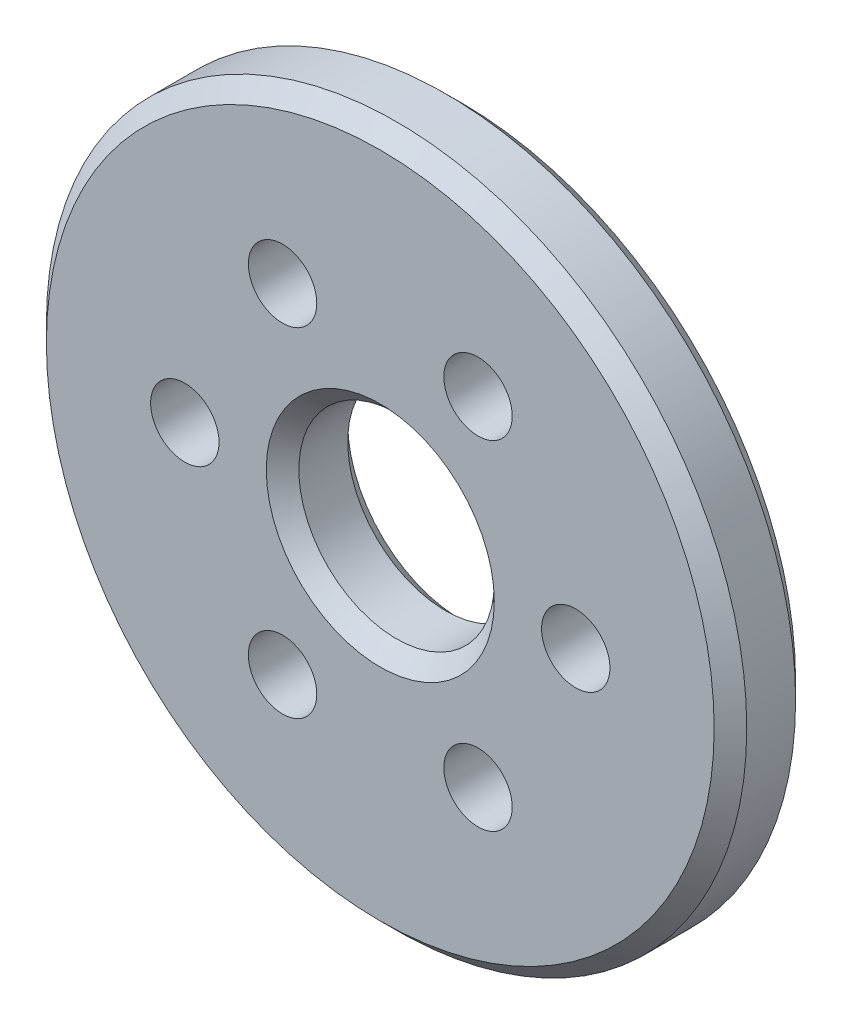
ISO-10303-21;
HEADER;
FILE_DESCRIPTION(('STEP AP214'),'2;1');
FILE_NAME('part.step','',(''),(''),'','','');
FILE_SCHEMA(('AUTOMOTIVE_DESIGN { 1 0 10303 214 1 1 1 1 }'));
ENDSEC;
DATA;
#1=APPLICATION_CONTEXT('core data for automotive mechanical design processes');
#2=APPLICATION_PROTOCOL_DEFINITION('international standard','automotive_design',2000,#1);
#3=PRODUCT_CONTEXT('',#1,'mechanical');
#4=PRODUCT('Part','Part','',(#3));
#5=PRODUCT_RELATED_PRODUCT_CATEGORY('part','',(#4));
#6=PRODUCT_DEFINITION_FORMATION('','',#4);
#7=PRODUCT_DEFINITION_CONTEXT('part definition',#1,'design');
#8=PRODUCT_DEFINITION('design','',#6,#7);
#9=PRODUCT_DEFINITION_SHAPE('','',#8);
#10=(LENGTH_UNIT() NAMED_UNIT(*) SI_UNIT(.MILLI.,.METRE.));
#11=(NAMED_UNIT(*) PLANE_ANGLE_UNIT() SI_UNIT($,.RADIAN.));
#12=(NAMED_UNIT(*) SI_UNIT($,.STERADIAN.) SOLID_ANGLE_UNIT());
#13=UNCERTAINTY_MEASURE_WITH_UNIT(LENGTH_MEASURE(1.E-05),#10,'distance_accuracy_value','');
#14=(GEOMETRIC_REPRESENTATION_CONTEXT(3) GLOBAL_UNCERTAINTY_ASSIGNED_CONTEXT((#13)) GLOBAL_UNIT_ASSIGNED_CONTEXT((#10,
#11,#12)) REPRESENTATION_CONTEXT('',''));
#15=CARTESIAN_POINT('',(0.,0.,0.));
#16=DIRECTION('',(0.,0.,1.));
#17=DIRECTION('',(1.,0.,0.));
#18=AXIS2_PLACEMENT_3D('',#15,#16,#17);
#19=CARTESIAN_POINT('',(0.,0.,-5.));
#20=DIRECTION('',(0.,0.,-1.));
#21=DIRECTION('',(1.,0.,0.));
#22=AXIS2_PLACEMENT_3D('',#19,#20,#21);
#23=PLANE('',#22);
#24=CARTESIAN_POINT('',(0.,0.,-5.));
#25=DIRECTION('',(0.,0.,1.));
#26=DIRECTION('',(1.,0.,0.));
#27=AXIS2_PLACEMENT_3D('',#24,#25,#26);
#28=CIRCLE('',#27,7.00000000000001);
#29=CARTESIAN_POINT('',(7.00000000000001,0.,-5.));
#30=VERTEX_POINT('',#29);
#31=EDGE_CURVE('E60',#30,#30,#28,.F.);
#32=ORIENTED_EDGE('',*,*,#31,.F.);
#33=EDGE_LOOP('',(#32));
#34=FACE_BOUND('',#33,.T.);
#35=CARTESIAN_POINT('',(0.,0.,-5.));
#36=DIRECTION('',(0.,0.,1.));
#37=DIRECTION('',(1.,0.,0.));
#38=AXIS2_PLACEMENT_3D('',#35,#36,#37);
#39=CIRCLE('',#38,20.5);
#40=CARTESIAN_POINT('',(20.5,0.,-5.));
#41=VERTEX_POINT('',#40);
#42=EDGE_CURVE('E66',#41,#41,#39,.T.);
#43=ORIENTED_EDGE('',*,*,#42,.F.);
#44=EDGE_LOOP('',(#43));
#45=FACE_BOUND('',#44,.T.);
#46=CARTESIAN_POINT('',(-5.9999999999999,10.3923048454133,-5.));
#47=DIRECTION('',(0.,0.,1.));
#48=DIRECTION('',(1.,0.,0.));
#49=AXIS2_PLACEMENT_3D('',#46,#47,#48);
#50=CIRCLE('',#49,2.1);
#51=CARTESIAN_POINT('',(-3.89999999999991,10.3923048454133,-5.));
#52=VERTEX_POINT('',#51);
#53=EDGE_CURVE('E115',#52,#52,#50,.T.);
#54=ORIENTED_EDGE('',*,*,#53,.T.);
#55=EDGE_LOOP('',(#54));
#56=FACE_BOUND('',#55,.T.);
#57=CARTESIAN_POINT('',(-6.00000000000005,-10.3923048454132,-5.));
#58=DIRECTION('',(0.,0.,1.));
#59=DIRECTION('',(1.,0.,0.));
#60=AXIS2_PLACEMENT_3D('',#57,#58,#59);
#61=CIRCLE('',#60,2.1);
#62=CARTESIAN_POINT('',(-3.90000000000005,-10.3923048454132,-5.));
#63=VERTEX_POINT('',#62);
#64=EDGE_CURVE('E100',#63,#63,#61,.T.);
#65=ORIENTED_EDGE('',*,*,#64,.T.);
#66=EDGE_LOOP('',(#65));
#67=FACE_BOUND('',#66,.T.);
#68=CARTESIAN_POINT('',(12.,0.,-5.));
#69=DIRECTION('',(0.,0.,1.));
#70=DIRECTION('',(1.,0.,0.));
#71=AXIS2_PLACEMENT_3D('',#68,#69,#70);
#72=CIRCLE('',#71,2.1);
#73=CARTESIAN_POINT('',(14.1,0.,-5.));
#74=VERTEX_POINT('',#73);
#75=EDGE_CURVE('E87',#74,#74,#72,.T.);
#76=ORIENTED_EDGE('',*,*,#75,.T.);
#77=EDGE_LOOP('',(#76));
#78=FACE_BOUND('',#77,.T.);
#79=CARTESIAN_POINT('',(5.99999999999998,-10.3923048454133,-5.));
#80=DIRECTION('',(0.,0.,1.));
#81=DIRECTION('',(1.,0.,0.));
#82=AXIS2_PLACEMENT_3D('',#79,#80,#81);
#83=CIRCLE('',#82,2.1);
#84=CARTESIAN_POINT('',(8.09999999999997,-10.3923048454133,-5.));
#85=VERTEX_POINT('',#84);
#86=EDGE_CURVE('E92',#85,#85,#83,.T.);
#87=ORIENTED_EDGE('',*,*,#86,.T.);
#88=EDGE_LOOP('',(#87));
#89=FACE_BOUND('',#88,.T.);
#90=CARTESIAN_POINT('',(-12.,0.,-5.));
#91=DIRECTION('',(0.,0.,1.));
#92=DIRECTION('',(1.,0.,0.));
#93=AXIS2_PLACEMENT_3D('',#90,#91,#92);
#94=CIRCLE('',#93,2.1);
#95=CARTESIAN_POINT('',(-9.9,0.,-5.));
#96=VERTEX_POINT('',#95);
#97=EDGE_CURVE('E107',#96,#96,#94,.T.);
#98=ORIENTED_EDGE('',*,*,#97,.T.);
#99=EDGE_LOOP('',(#98));
#100=FACE_BOUND('',#99,.T.);
#101=CARTESIAN_POINT('',(6.00000000000012,10.3923048454132,-5.));
#102=DIRECTION('',(0.,0.,1.));
#103=DIRECTION('',(1.,0.,0.));
#104=AXIS2_PLACEMENT_3D('',#101,#102,#103);
#105=CIRCLE('',#104,2.1);
#106=CARTESIAN_POINT('',(8.10000000000012,10.3923048454132,-5.));
#107=VERTEX_POINT('',#106);
#108=EDGE_CURVE('E123',#107,#107,#105,.T.);
#109=ORIENTED_EDGE('',*,*,#108,.T.);
#110=EDGE_LOOP('',(#109));
#111=FACE_BOUND('',#110,.T.);
#112=ADVANCED_FACE('F45',(#34,#45,#56,#67,#78,#89,#100,#111),#23,.T.);
#113=CARTESIAN_POINT('',(0.,0.,0.));
#114=DIRECTION('',(0.,0.,-1.));
#115=DIRECTION('',(1.,0.,0.));
#116=AXIS2_PLACEMENT_3D('',#113,#114,#115);
#117=PLANE('',#116);
#118=CARTESIAN_POINT('',(0.,0.,0.));
#119=DIRECTION('',(0.,0.,1.));
#120=DIRECTION('',(1.,0.,0.));
#121=AXIS2_PLACEMENT_3D('',#118,#119,#120);
#122=CIRCLE('',#121,7.);
#123=CARTESIAN_POINT('',(7.,0.,0.));
#124=VERTEX_POINT('',#123);
#125=EDGE_CURVE('E79',#124,#124,#122,.T.);
#126=ORIENTED_EDGE('',*,*,#125,.F.);
#127=EDGE_LOOP('',(#126));
#128=FACE_BOUND('',#127,.T.);
#129=CARTESIAN_POINT('',(0.,0.,0.));
#130=DIRECTION('',(0.,0.,1.));
#131=DIRECTION('',(1.,0.,0.));
#132=AXIS2_PLACEMENT_3D('',#129,#130,#131);
#133=CIRCLE('',#132,20.5);
#134=CARTESIAN_POINT('',(20.5,0.,0.));
#135=VERTEX_POINT('',#134);
#136=EDGE_CURVE('E83',#135,#135,#133,.F.);
#137=ORIENTED_EDGE('',*,*,#136,.F.);
#138=EDGE_LOOP('',(#137));
#139=FACE_BOUND('',#138,.T.);
#140=CARTESIAN_POINT('',(12.,0.,0.));
#141=DIRECTION('',(0.,0.,1.));
#142=DIRECTION('',(1.,0.,0.));
#143=AXIS2_PLACEMENT_3D('',#140,#141,#142);
#144=CIRCLE('',#143,2.1);
#145=CARTESIAN_POINT('',(14.1,0.,0.));
#146=VERTEX_POINT('',#145);
#147=EDGE_CURVE('E88',#146,#146,#144,.T.);
#148=ORIENTED_EDGE('',*,*,#147,.F.);
#149=EDGE_LOOP('',(#148));
#150=FACE_BOUND('',#149,.T.);
#151=CARTESIAN_POINT('',(5.99999999999998,-10.3923048454133,0.));
#152=DIRECTION('',(0.,0.,1.));
#153=DIRECTION('',(1.,0.,0.));
#154=AXIS2_PLACEMENT_3D('',#151,#152,#153);
#155=CIRCLE('',#154,2.1);
#156=CARTESIAN_POINT('',(8.09999999999997,-10.3923048454133,0.));
#157=VERTEX_POINT('',#156);
#158=EDGE_CURVE('E96',#157,#157,#155,.T.);
#159=ORIENTED_EDGE('',*,*,#158,.F.);
#160=EDGE_LOOP('',(#159));
#161=FACE_BOUND('',#160,.T.);
#162=CARTESIAN_POINT('',(-6.00000000000005,-10.3923048454132,0.));
#163=DIRECTION('',(0.,0.,1.));
#164=DIRECTION('',(1.,0.,0.));
#165=AXIS2_PLACEMENT_3D('',#162,#163,#164);
#166=CIRCLE('',#165,2.1);
#167=CARTESIAN_POINT('',(-3.90000000000005,-10.3923048454132,0.));
#168=VERTEX_POINT('',#167);
#169=EDGE_CURVE('E103',#168,#168,#166,.T.);
#170=ORIENTED_EDGE('',*,*,#169,.F.);
#171=EDGE_LOOP('',(#170));
#172=FACE_BOUND('',#171,.T.);
#173=CARTESIAN_POINT('',(-12.,0.,0.));
#174=DIRECTION('',(0.,0.,1.));
#175=DIRECTION('',(1.,0.,0.));
#176=AXIS2_PLACEMENT_3D('',#173,#174,#175);
#177=CIRCLE('',#176,2.1);
#178=CARTESIAN_POINT('',(-9.9,0.,0.));
#179=VERTEX_POINT('',#178);
#180=EDGE_CURVE('E111',#179,#179,#177,.T.);
#181=ORIENTED_EDGE('',*,*,#180,.F.);
#182=EDGE_LOOP('',(#181));
#183=FACE_BOUND('',#182,.T.);
#184=CARTESIAN_POINT('',(-5.9999999999999,10.3923048454133,0.));
#185=DIRECTION('',(0.,0.,1.));
#186=DIRECTION('',(1.,0.,0.));
#187=AXIS2_PLACEMENT_3D('',#184,#185,#186);
#188=CIRCLE('',#187,2.1);
#189=CARTESIAN_POINT('',(-3.89999999999991,10.3923048454133,0.));
#190=VERTEX_POINT('',#189);
#191=EDGE_CURVE('E119',#190,#190,#188,.T.);
#192=ORIENTED_EDGE('',*,*,#191,.F.);
#193=EDGE_LOOP('',(#192));
#194=FACE_BOUND('',#193,.T.);
#195=CARTESIAN_POINT('',(6.00000000000012,10.3923048454132,0.));
#196=DIRECTION('',(0.,0.,1.));
#197=DIRECTION('',(1.,0.,0.));
#198=AXIS2_PLACEMENT_3D('',#195,#196,#197);
#199=CIRCLE('',#198,2.1);
#200=CARTESIAN_POINT('',(8.10000000000012,10.3923048454132,0.));
#201=VERTEX_POINT('',#200);
#202=EDGE_CURVE('E126',#201,#201,#199,.T.);
#203=ORIENTED_EDGE('',*,*,#202,.F.);
#204=EDGE_LOOP('',(#203));
#205=FACE_BOUND('',#204,.T.);
#206=ADVANCED_FACE('F143',(#128,#139,#150,#161,#172,#183,#194,#205),#117,.F.);
#207=CARTESIAN_POINT('',(0.,0.,-5.));
#208=DIRECTION('',(0.,0.,1.));
#209=DIRECTION('',(-1.,0.,0.));
#210=AXIS2_PLACEMENT_3D('',#207,#208,#209);
#211=CYLINDRICAL_SURFACE('',#210,21.5);
#212=CARTESIAN_POINT('',(0.,0.,-1.));
#213=DIRECTION('',(0.,0.,1.));
#214=DIRECTION('',(1.,0.,0.));
#215=AXIS2_PLACEMENT_3D('',#212,#213,#214);
#216=CIRCLE('',#215,21.5);
#217=CARTESIAN_POINT('',(21.5,0.,-1.));
#218=VERTEX_POINT('',#217);
#219=EDGE_CURVE('E10',#218,#218,#216,.T.);
#220=ORIENTED_EDGE('',*,*,#219,.F.);
#221=EDGE_LOOP('',(#220));
#222=FACE_BOUND('',#221,.T.);
#223=CARTESIAN_POINT('',(0.,0.,-4.00000000000001));
#224=DIRECTION('',(0.,0.,1.));
#225=DIRECTION('',(1.,0.,0.));
#226=AXIS2_PLACEMENT_3D('',#223,#224,#225);
#227=CIRCLE('',#226,21.5);
#228=CARTESIAN_POINT('',(21.5,0.,-4.00000000000001));
#229=VERTEX_POINT('',#228);
#230=EDGE_CURVE('E53',#229,#229,#227,.F.);
#231=ORIENTED_EDGE('',*,*,#230,.F.);
#232=EDGE_LOOP('',(#231));
#233=FACE_BOUND('',#232,.T.);
#234=ADVANCED_FACE('F145',(#222,#233),#211,.T.);
#235=CARTESIAN_POINT('',(12.,0.,-5.));
#236=DIRECTION('',(0.,0.,1.));
#237=DIRECTION('',(-1.,0.,0.));
#238=AXIS2_PLACEMENT_3D('',#235,#236,#237);
#239=CYLINDRICAL_SURFACE('',#238,2.1);
#240=ORIENTED_EDGE('',*,*,#75,.F.);
#241=EDGE_LOOP('',(#240));
#242=FACE_BOUND('',#241,.T.);
#243=ORIENTED_EDGE('',*,*,#147,.T.);
#244=EDGE_LOOP('',(#243));
#245=FACE_BOUND('',#244,.T.);
#246=ADVANCED_FACE('F152',(#242,#245),#239,.F.);
#247=CARTESIAN_POINT('',(0.,0.,-5.));
#248=DIRECTION('',(0.,0.,1.));
#249=DIRECTION('',(-1.,0.,0.));
#250=AXIS2_PLACEMENT_3D('',#247,#248,#249);
#251=CYLINDRICAL_SURFACE('',#250,6.);
#252=CARTESIAN_POINT('',(0.,0.,-0.999999999999997));
#253=DIRECTION('',(0.,0.,1.));
#254=DIRECTION('',(1.,0.,0.));
#255=AXIS2_PLACEMENT_3D('',#252,#253,#254);
#256=CIRCLE('',#255,6.);
#257=CARTESIAN_POINT('',(6.,0.,-0.999999999999997));
#258=VERTEX_POINT('',#257);
#259=EDGE_CURVE('E72',#258,#258,#256,.F.);
#260=ORIENTED_EDGE('',*,*,#259,.F.);
#261=EDGE_LOOP('',(#260));
#262=FACE_BOUND('',#261,.T.);
#263=CARTESIAN_POINT('',(0.,0.,-4.));
#264=DIRECTION('',(0.,0.,1.));
#265=DIRECTION('',(1.,0.,0.));
#266=AXIS2_PLACEMENT_3D('',#263,#264,#265);
#267=CIRCLE('',#266,6.);
#268=CARTESIAN_POINT('',(6.,0.,-4.));
#269=VERTEX_POINT('',#268);
#270=EDGE_CURVE('E75',#269,#269,#267,.T.);
#271=ORIENTED_EDGE('',*,*,#270,.F.);
#272=EDGE_LOOP('',(#271));
#273=FACE_BOUND('',#272,.T.);
#274=ADVANCED_FACE('F203',(#262,#273),#251,.F.);
#275=CARTESIAN_POINT('',(5.99999999999998,-10.3923048454133,-5.));
#276=DIRECTION('',(0.,0.,1.));
#277=DIRECTION('',(-1.,0.,0.));
#278=AXIS2_PLACEMENT_3D('',#275,#276,#277);
#279=CYLINDRICAL_SURFACE('',#278,2.1);
#280=ORIENTED_EDGE('',*,*,#86,.F.);
#281=EDGE_LOOP('',(#280));
#282=FACE_BOUND('',#281,.T.);
#283=ORIENTED_EDGE('',*,*,#158,.T.);
#284=EDGE_LOOP('',(#283));
#285=FACE_BOUND('',#284,.T.);
#286=ADVANCED_FACE('F199',(#282,#285),#279,.F.);
#287=CARTESIAN_POINT('',(-6.00000000000005,-10.3923048454132,-5.));
#288=DIRECTION('',(0.,0.,1.));
#289=DIRECTION('',(-1.,0.,0.));
#290=AXIS2_PLACEMENT_3D('',#287,#288,#289);
#291=CYLINDRICAL_SURFACE('',#290,2.1);
#292=ORIENTED_EDGE('',*,*,#64,.F.);
#293=EDGE_LOOP('',(#292));
#294=FACE_BOUND('',#293,.T.);
#295=ORIENTED_EDGE('',*,*,#169,.T.);
#296=EDGE_LOOP('',(#295));
#297=FACE_BOUND('',#296,.T.);
#298=ADVANCED_FACE('F192',(#294,#297),#291,.F.);
#299=CARTESIAN_POINT('',(-12.,0.,-5.));
#300=DIRECTION('',(0.,0.,1.));
#301=DIRECTION('',(-1.,0.,0.));
#302=AXIS2_PLACEMENT_3D('',#299,#300,#301);
#303=CYLINDRICAL_SURFACE('',#302,2.1);
#304=ORIENTED_EDGE('',*,*,#97,.F.);
#305=EDGE_LOOP('',(#304));
#306=FACE_BOUND('',#305,.T.);
#307=ORIENTED_EDGE('',*,*,#180,.T.);
#308=EDGE_LOOP('',(#307));
#309=FACE_BOUND('',#308,.T.);
#310=ADVANCED_FACE('F186',(#306,#309),#303,.F.);
#311=CARTESIAN_POINT('',(-5.9999999999999,10.3923048454133,-5.));
#312=DIRECTION('',(0.,0.,1.));
#313=DIRECTION('',(-1.,0.,0.));
#314=AXIS2_PLACEMENT_3D('',#311,#312,#313);
#315=CYLINDRICAL_SURFACE('',#314,2.1);
#316=ORIENTED_EDGE('',*,*,#53,.F.);
#317=EDGE_LOOP('',(#316));
#318=FACE_BOUND('',#317,.T.);
#319=ORIENTED_EDGE('',*,*,#191,.T.);
#320=EDGE_LOOP('',(#319));
#321=FACE_BOUND('',#320,.T.);
#322=ADVANCED_FACE('F139',(#318,#321),#315,.F.);
#323=CARTESIAN_POINT('',(6.00000000000012,10.3923048454132,-5.));
#324=DIRECTION('',(0.,0.,1.));
#325=DIRECTION('',(-1.,0.,0.));
#326=AXIS2_PLACEMENT_3D('',#323,#324,#325);
#327=CYLINDRICAL_SURFACE('',#326,2.1);
#328=ORIENTED_EDGE('',*,*,#108,.F.);
#329=EDGE_LOOP('',(#328));
#330=FACE_BOUND('',#329,.T.);
#331=ORIENTED_EDGE('',*,*,#202,.T.);
#332=EDGE_LOOP('',(#331));
#333=FACE_BOUND('',#332,.T.);
#334=ADVANCED_FACE('F135',(#330,#333),#327,.F.);
#335=CARTESIAN_POINT('',(0.,0.,0.));
#336=DIRECTION('',(0.,0.,1.));
#337=DIRECTION('',(-1.,0.,0.));
#338=AXIS2_PLACEMENT_3D('',#335,#336,#337);
#339=CONICAL_SURFACE('',#338,7.,0.785398163397449);
#340=ORIENTED_EDGE('',*,*,#259,.T.);
#341=EDGE_LOOP('',(#340));
#342=FACE_BOUND('',#341,.T.);
#343=ORIENTED_EDGE('',*,*,#125,.T.);
#344=EDGE_LOOP('',(#343));
#345=FACE_BOUND('',#344,.T.);
#346=ADVANCED_FACE('F138',(#342,#345),#339,.F.);
#347=CARTESIAN_POINT('',(0.,0.,-4.));
#348=DIRECTION('',(0.,0.,-1.));
#349=DIRECTION('',(1.,0.,0.));
#350=AXIS2_PLACEMENT_3D('',#347,#348,#349);
#351=CONICAL_SURFACE('',#350,6.,0.785398163397452);
#352=ORIENTED_EDGE('',*,*,#31,.T.);
#353=EDGE_LOOP('',(#352));
#354=FACE_BOUND('',#353,.T.);
#355=ORIENTED_EDGE('',*,*,#270,.T.);
#356=EDGE_LOOP('',(#355));
#357=FACE_BOUND('',#356,.T.);
#358=ADVANCED_FACE('F163',(#354,#357),#351,.F.);
#359=CARTESIAN_POINT('',(0.,0.,-1.));
#360=DIRECTION('',(0.,0.,-1.));
#361=DIRECTION('',(1.,0.,0.));
#362=AXIS2_PLACEMENT_3D('',#359,#360,#361);
#363=CONICAL_SURFACE('',#362,21.5,0.785398163397447);
#364=ORIENTED_EDGE('',*,*,#136,.T.);
#365=EDGE_LOOP('',(#364));
#366=FACE_BOUND('',#365,.T.);
#367=ORIENTED_EDGE('',*,*,#219,.T.);
#368=EDGE_LOOP('',(#367));
#369=FACE_BOUND('',#368,.T.);
#370=ADVANCED_FACE('F166',(#366,#369),#363,.T.);
#371=CARTESIAN_POINT('',(0.,0.,-5.));
#372=DIRECTION('',(0.,0.,1.));
#373=DIRECTION('',(-1.,0.,0.));
#374=AXIS2_PLACEMENT_3D('',#371,#372,#373);
#375=CONICAL_SURFACE('',#374,20.5,0.785398163397447);
#376=ORIENTED_EDGE('',*,*,#230,.T.);
#377=EDGE_LOOP('',(#376));
#378=FACE_BOUND('',#377,.T.);
#379=ORIENTED_EDGE('',*,*,#42,.T.);
#380=EDGE_LOOP('',(#379));
#381=FACE_BOUND('',#380,.T.);
#382=ADVANCED_FACE('F47',(#378,#381),#375,.T.);
#383=CLOSED_SHELL('',(#112,#206,#234,#246,#274,#286,#298,#310,#322,#334,#346,#358,#370,#382));
#384=MANIFOLD_SOLID_BREP('B2',#383);
#385=ADVANCED_BREP_SHAPE_REPRESENTATION('',(#18,#384),#14);
#386=SHAPE_DEFINITION_REPRESENTATION(#9,#385);
ENDSEC;
END-ISO-10303-21;
